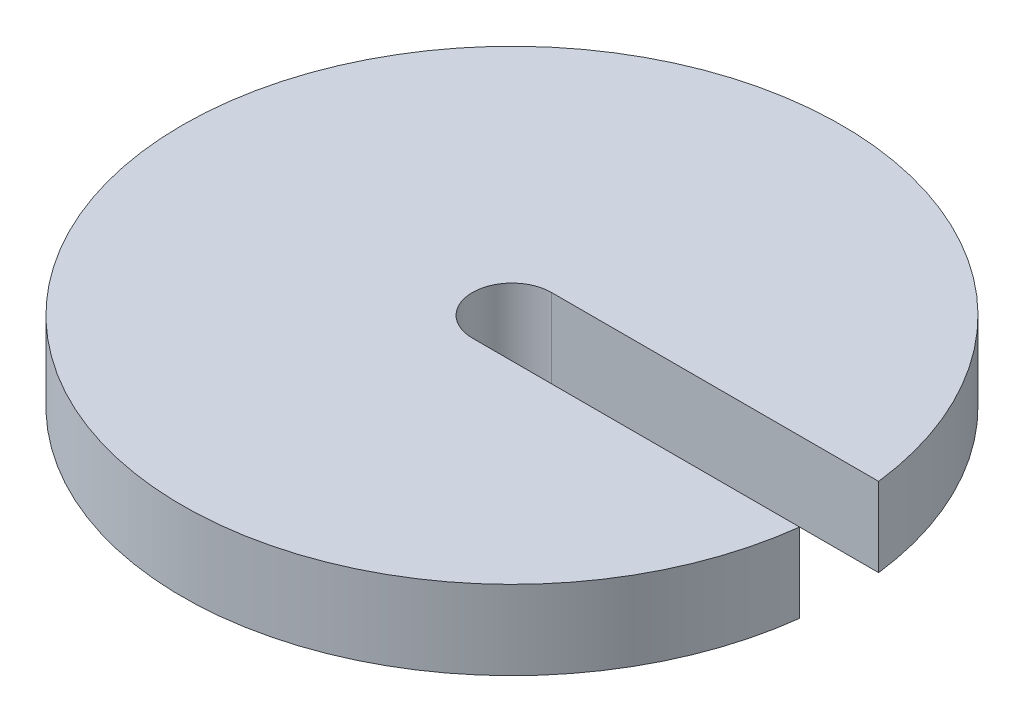
ISO-10303-21;
HEADER;
FILE_DESCRIPTION(('STEP AP214'),'2;1');
FILE_NAME('part.step','',(''),(''),'','','');
FILE_SCHEMA(('AUTOMOTIVE_DESIGN { 1 0 10303 214 1 1 1 1 }'));
ENDSEC;
DATA;
#1=APPLICATION_CONTEXT('core data for automotive mechanical design processes');
#2=APPLICATION_PROTOCOL_DEFINITION('international standard','automotive_design',2000,#1);
#3=PRODUCT_CONTEXT('',#1,'mechanical');
#4=PRODUCT('Part','Part','',(#3));
#5=PRODUCT_RELATED_PRODUCT_CATEGORY('part','',(#4));
#6=PRODUCT_DEFINITION_FORMATION('','',#4);
#7=PRODUCT_DEFINITION_CONTEXT('part definition',#1,'design');
#8=PRODUCT_DEFINITION('design','',#6,#7);
#9=PRODUCT_DEFINITION_SHAPE('','',#8);
#10=(LENGTH_UNIT() NAMED_UNIT(*) SI_UNIT(.MILLI.,.METRE.));
#11=(NAMED_UNIT(*) PLANE_ANGLE_UNIT() SI_UNIT($,.RADIAN.));
#12=(NAMED_UNIT(*) SI_UNIT($,.STERADIAN.) SOLID_ANGLE_UNIT());
#13=UNCERTAINTY_MEASURE_WITH_UNIT(LENGTH_MEASURE(1.E-05),#10,'distance_accuracy_value','');
#14=(GEOMETRIC_REPRESENTATION_CONTEXT(3) GLOBAL_UNCERTAINTY_ASSIGNED_CONTEXT((#13)) GLOBAL_UNIT_ASSIGNED_CONTEXT((#10,
#11,#12)) REPRESENTATION_CONTEXT('',''));
#15=CARTESIAN_POINT('',(0.,0.,0.));
#16=DIRECTION('',(0.,0.,1.));
#17=DIRECTION('',(1.,0.,0.));
#18=AXIS2_PLACEMENT_3D('',#15,#16,#17);
#19=CARTESIAN_POINT('',(-93.578018867783,-12.,84.528638332522));
#20=DIRECTION('',(0.,-1.,0.));
#21=DIRECTION('',(0.,0.,-1.));
#22=AXIS2_PLACEMENT_3D('',#19,#20,#21);
#23=PLANE('',#22);
#24=DIRECTION('',(-1.,0.,0.));
#25=VECTOR('',#24,1.);
#26=CARTESIAN_POINT('',(24.8193472919815,-11.9999999999997,6.));
#27=LINE('',#26,#25);
#28=CARTESIAN_POINT('',(49.6386945839632,-11.9999999999998,6.));
#29=VERTEX_POINT('',#28);
#30=CARTESIAN_POINT('',(0.,-11.9999999999998,6.));
#31=VERTEX_POINT('',#30);
#32=EDGE_CURVE('E67',#29,#31,#27,.T.);
#33=ORIENTED_EDGE('',*,*,#32,.F.);
#34=CARTESIAN_POINT('',(0.,-12.,0.));
#35=DIRECTION('',(0.,1.,0.));
#36=DIRECTION('',(0.,0.,1.));
#37=AXIS2_PLACEMENT_3D('',#34,#35,#36);
#38=CIRCLE('',#37,50.);
#39=CARTESIAN_POINT('',(49.6386945839632,-11.9999999999998,-6.));
#40=VERTEX_POINT('',#39);
#41=EDGE_CURVE('E21',#29,#40,#38,.F.);
#42=ORIENTED_EDGE('',*,*,#41,.T.);
#43=DIRECTION('',(1.,0.,0.));
#44=VECTOR('',#43,1.);
#45=CARTESIAN_POINT('',(24.8193472919815,-11.9999999999997,-6.));
#46=LINE('',#45,#44);
#47=CARTESIAN_POINT('',(0.,-11.9999999999998,-6.));
#48=VERTEX_POINT('',#47);
#49=EDGE_CURVE('E81',#48,#40,#46,.T.);
#50=ORIENTED_EDGE('',*,*,#49,.F.);
#51=CARTESIAN_POINT('',(0.,-12.,0.));
#52=DIRECTION('',(0.,-1.,0.));
#53=DIRECTION('',(0.,0.,-1.));
#54=AXIS2_PLACEMENT_3D('',#51,#52,#53);
#55=CIRCLE('',#54,6.);
#56=EDGE_CURVE('E68',#31,#48,#55,.T.);
#57=ORIENTED_EDGE('',*,*,#56,.F.);
#58=EDGE_LOOP('',(#33,#42,#50,#57));
#59=FACE_BOUND('',#58,.T.);
#60=ADVANCED_FACE('F17',(#59),#23,.T.);
#61=CARTESIAN_POINT('',(0.,-12.,0.));
#62=DIRECTION('',(0.,1.,0.));
#63=DIRECTION('',(0.,0.,1.));
#64=AXIS2_PLACEMENT_3D('',#61,#62,#63);
#65=CYLINDRICAL_SURFACE('',#64,50.);
#66=DIRECTION('',(0.,1.,0.));
#67=VECTOR('',#66,1.);
#68=CARTESIAN_POINT('',(49.638694583963,-24.8193472919815,-6.));
#69=LINE('',#68,#67);
#70=CARTESIAN_POINT('',(49.6386945839632,0.,-6.));
#71=VERTEX_POINT('',#70);
#72=EDGE_CURVE('E62',#40,#71,#69,.T.);
#73=ORIENTED_EDGE('',*,*,#72,.F.);
#74=ORIENTED_EDGE('',*,*,#41,.F.);
#75=DIRECTION('',(0.,-1.,0.));
#76=VECTOR('',#75,1.);
#77=CARTESIAN_POINT('',(49.638694583963,-24.8193472919815,6.));
#78=LINE('',#77,#76);
#79=CARTESIAN_POINT('',(49.6386945839632,0.,6.));
#80=VERTEX_POINT('',#79);
#81=EDGE_CURVE('E59',#80,#29,#78,.T.);
#82=ORIENTED_EDGE('',*,*,#81,.F.);
#83=CARTESIAN_POINT('',(0.,0.,0.));
#84=DIRECTION('',(0.,1.,0.));
#85=DIRECTION('',(0.,0.,1.));
#86=AXIS2_PLACEMENT_3D('',#83,#84,#85);
#87=CIRCLE('',#86,50.);
#88=EDGE_CURVE('E85',#71,#80,#87,.T.);
#89=ORIENTED_EDGE('',*,*,#88,.F.);
#90=EDGE_LOOP('',(#73,#74,#82,#89));
#91=FACE_BOUND('',#90,.T.);
#92=ADVANCED_FACE('F57',(#91),#65,.T.);
#93=CARTESIAN_POINT('',(49.638694583963,0.,6.));
#94=DIRECTION('',(0.,0.,-1.));
#95=DIRECTION('',(0.,-1.,0.));
#96=AXIS2_PLACEMENT_3D('',#93,#94,#95);
#97=PLANE('',#96);
#98=ORIENTED_EDGE('',*,*,#32,.T.);
#99=DIRECTION('',(0.,-1.,0.));
#100=VECTOR('',#99,1.);
#101=CARTESIAN_POINT('',(0.,-6.,6.));
#102=LINE('',#101,#100);
#103=CARTESIAN_POINT('',(0.,0.,6.));
#104=VERTEX_POINT('',#103);
#105=EDGE_CURVE('E71',#104,#31,#102,.T.);
#106=ORIENTED_EDGE('',*,*,#105,.F.);
#107=DIRECTION('',(-1.,0.,0.));
#108=VECTOR('',#107,1.);
#109=CARTESIAN_POINT('',(-21.7890094338915,0.,6.00000000000001));
#110=LINE('',#109,#108);
#111=EDGE_CURVE('E75',#80,#104,#110,.T.);
#112=ORIENTED_EDGE('',*,*,#111,.F.);
#113=ORIENTED_EDGE('',*,*,#81,.T.);
#114=EDGE_LOOP('',(#98,#106,#112,#113));
#115=FACE_BOUND('',#114,.T.);
#116=ADVANCED_FACE('F73',(#115),#97,.T.);
#117=CARTESIAN_POINT('',(0.,0.,0.));
#118=DIRECTION('',(0.,-1.,0.));
#119=DIRECTION('',(0.,0.,-1.));
#120=AXIS2_PLACEMENT_3D('',#117,#118,#119);
#121=CYLINDRICAL_SURFACE('',#120,6.);
#122=ORIENTED_EDGE('',*,*,#56,.T.);
#123=DIRECTION('',(0.,-1.,0.));
#124=VECTOR('',#123,1.);
#125=CARTESIAN_POINT('',(0.,-24.8193472919815,-6.));
#126=LINE('',#125,#124);
#127=CARTESIAN_POINT('',(0.,0.,-6.));
#128=VERTEX_POINT('',#127);
#129=EDGE_CURVE('E36',#128,#48,#126,.T.);
#130=ORIENTED_EDGE('',*,*,#129,.F.);
#131=CARTESIAN_POINT('',(0.,0.,0.));
#132=DIRECTION('',(0.,-1.,0.));
#133=DIRECTION('',(0.,0.,-1.));
#134=AXIS2_PLACEMENT_3D('',#131,#132,#133);
#135=CIRCLE('',#134,6.);
#136=EDGE_CURVE('E27',#104,#128,#135,.T.);
#137=ORIENTED_EDGE('',*,*,#136,.F.);
#138=ORIENTED_EDGE('',*,*,#105,.T.);
#139=EDGE_LOOP('',(#122,#130,#137,#138));
#140=FACE_BOUND('',#139,.T.);
#141=ADVANCED_FACE('F87',(#140),#121,.F.);
#142=CARTESIAN_POINT('',(0.,0.,-6.));
#143=DIRECTION('',(0.,0.,1.));
#144=DIRECTION('',(0.,-1.,0.));
#145=AXIS2_PLACEMENT_3D('',#142,#143,#144);
#146=PLANE('',#145);
#147=ORIENTED_EDGE('',*,*,#49,.T.);
#148=ORIENTED_EDGE('',*,*,#72,.T.);
#149=DIRECTION('',(1.,0.,0.));
#150=VECTOR('',#149,1.);
#151=CARTESIAN_POINT('',(-21.7890094338915,0.,-5.99999999999999));
#152=LINE('',#151,#150);
#153=EDGE_CURVE('E11',#128,#71,#152,.T.);
#154=ORIENTED_EDGE('',*,*,#153,.F.);
#155=ORIENTED_EDGE('',*,*,#129,.T.);
#156=EDGE_LOOP('',(#147,#148,#154,#155));
#157=FACE_BOUND('',#156,.T.);
#158=ADVANCED_FACE('F91',(#157),#146,.T.);
#159=CARTESIAN_POINT('',(-93.578018867783,0.,-84.528638332522));
#160=DIRECTION('',(0.,1.,0.));
#161=DIRECTION('',(0.,0.,1.));
#162=AXIS2_PLACEMENT_3D('',#159,#160,#161);
#163=PLANE('',#162);
#164=ORIENTED_EDGE('',*,*,#136,.T.);
#165=ORIENTED_EDGE('',*,*,#153,.T.);
#166=ORIENTED_EDGE('',*,*,#88,.T.);
#167=ORIENTED_EDGE('',*,*,#111,.T.);
#168=EDGE_LOOP('',(#164,#165,#166,#167));
#169=FACE_BOUND('',#168,.T.);
#170=ADVANCED_FACE('F19',(#169),#163,.T.);
#171=CLOSED_SHELL('',(#60,#92,#116,#141,#158,#170));
#172=MANIFOLD_SOLID_BREP('B1',#171);
#173=ADVANCED_BREP_SHAPE_REPRESENTATION('',(#18,#172),#14);
#174=SHAPE_DEFINITION_REPRESENTATION(#9,#173);
ENDSEC;
END-ISO-10303-21;
